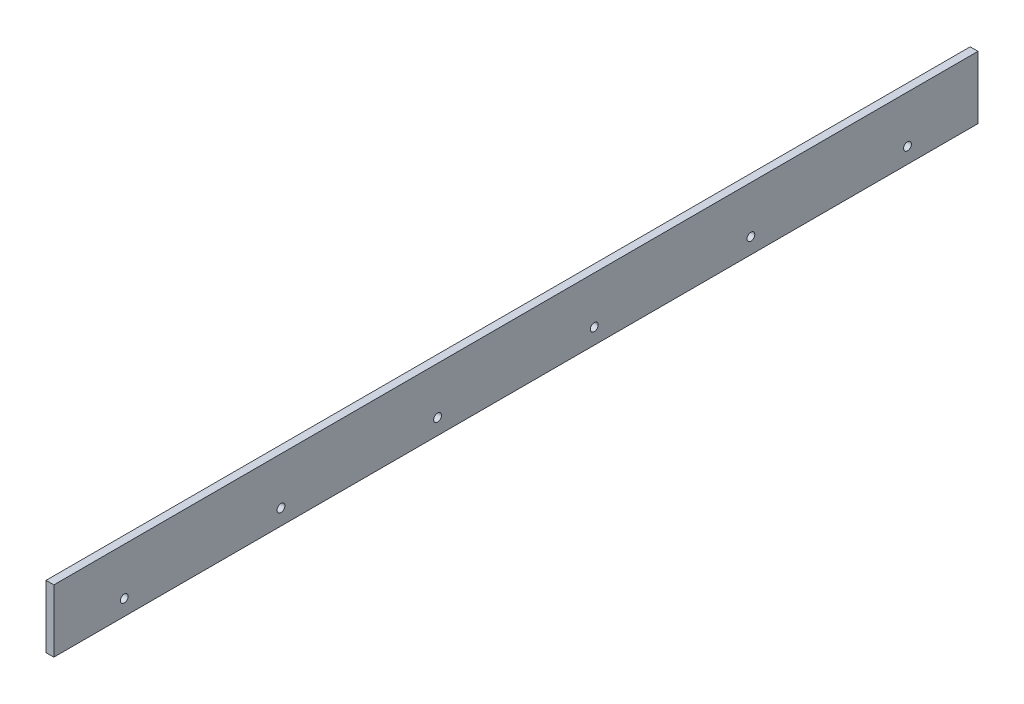
ISO-10303-21;
HEADER;
FILE_DESCRIPTION(('STEP AP214'),'2;1');
FILE_NAME('part.step','',(''),(''),'','','');
FILE_SCHEMA(('AUTOMOTIVE_DESIGN { 1 0 10303 214 1 1 1 1 }'));
ENDSEC;
DATA;
#1=APPLICATION_CONTEXT('core data for automotive mechanical design processes');
#2=APPLICATION_PROTOCOL_DEFINITION('international standard','automotive_design',2000,#1);
#3=PRODUCT_CONTEXT('',#1,'mechanical');
#4=PRODUCT('Part','Part','',(#3));
#5=PRODUCT_RELATED_PRODUCT_CATEGORY('part','',(#4));
#6=PRODUCT_DEFINITION_FORMATION('','',#4);
#7=PRODUCT_DEFINITION_CONTEXT('part definition',#1,'design');
#8=PRODUCT_DEFINITION('design','',#6,#7);
#9=PRODUCT_DEFINITION_SHAPE('','',#8);
#10=(LENGTH_UNIT() NAMED_UNIT(*) SI_UNIT(.MILLI.,.METRE.));
#11=(NAMED_UNIT(*) PLANE_ANGLE_UNIT() SI_UNIT($,.RADIAN.));
#12=(NAMED_UNIT(*) SI_UNIT($,.STERADIAN.) SOLID_ANGLE_UNIT());
#13=UNCERTAINTY_MEASURE_WITH_UNIT(LENGTH_MEASURE(1.E-05),#10,'distance_accuracy_value','');
#14=(GEOMETRIC_REPRESENTATION_CONTEXT(3) GLOBAL_UNCERTAINTY_ASSIGNED_CONTEXT((#13)) GLOBAL_UNIT_ASSIGNED_CONTEXT((#10,
#11,#12)) REPRESENTATION_CONTEXT('',''));
#15=CARTESIAN_POINT('',(0.,0.,0.));
#16=DIRECTION('',(0.,0.,1.));
#17=DIRECTION('',(1.,0.,0.));
#18=AXIS2_PLACEMENT_3D('',#15,#16,#17);
#19=CARTESIAN_POINT('',(2.5,20.,590.));
#20=DIRECTION('',(-1.,0.,0.));
#21=DIRECTION('',(0.,-1.,0.));
#22=AXIS2_PLACEMENT_3D('',#19,#20,#21);
#23=PLANE('',#22);
#24=CARTESIAN_POINT('',(2.5,-10.,445.));
#25=DIRECTION('',(1.,0.,0.));
#26=DIRECTION('',(0.,1.,0.));
#27=AXIS2_PLACEMENT_3D('',#24,#25,#26);
#28=CIRCLE('',#27,2.50000000000002);
#29=CARTESIAN_POINT('',(2.5,-7.49999999999998,445.));
#30=VERTEX_POINT('',#29);
#31=EDGE_CURVE('E145',#30,#30,#28,.T.);
#32=ORIENTED_EDGE('',*,*,#31,.F.);
#33=EDGE_LOOP('',(#32));
#34=FACE_BOUND('',#33,.T.);
#35=DIRECTION('',(0.,1.,0.));
#36=VECTOR('',#35,1.);
#37=CARTESIAN_POINT('',(2.5,20.,0.));
#38=LINE('',#37,#36);
#39=CARTESIAN_POINT('',(2.5,-20.,0.));
#40=VERTEX_POINT('',#39);
#41=CARTESIAN_POINT('',(2.5,20.,0.));
#42=VERTEX_POINT('',#41);
#43=EDGE_CURVE('E103',#40,#42,#38,.T.);
#44=ORIENTED_EDGE('',*,*,#43,.T.);
#45=DIRECTION('',(0.,0.,-1.));
#46=VECTOR('',#45,1.);
#47=CARTESIAN_POINT('',(2.5,20.,590.));
#48=LINE('',#47,#46);
#49=CARTESIAN_POINT('',(2.5,20.,590.));
#50=VERTEX_POINT('',#49);
#51=EDGE_CURVE('E11',#50,#42,#48,.T.);
#52=ORIENTED_EDGE('',*,*,#51,.F.);
#53=DIRECTION('',(0.,1.,0.));
#54=VECTOR('',#53,1.);
#55=CARTESIAN_POINT('',(2.5,20.,590.));
#56=LINE('',#55,#54);
#57=CARTESIAN_POINT('',(2.5,-20.,590.));
#58=VERTEX_POINT('',#57);
#59=EDGE_CURVE('E90',#58,#50,#56,.T.);
#60=ORIENTED_EDGE('',*,*,#59,.F.);
#61=DIRECTION('',(0.,0.,-1.));
#62=VECTOR('',#61,1.);
#63=CARTESIAN_POINT('',(2.5,-20.,590.));
#64=LINE('',#63,#62);
#65=EDGE_CURVE('E99',#58,#40,#64,.T.);
#66=ORIENTED_EDGE('',*,*,#65,.T.);
#67=EDGE_LOOP('',(#44,#52,#60,#66));
#68=FACE_BOUND('',#67,.T.);
#69=CARTESIAN_POINT('',(2.5,-9.99999999999994,45.));
#70=DIRECTION('',(-1.,0.,0.));
#71=DIRECTION('',(0.,-1.,0.));
#72=AXIS2_PLACEMENT_3D('',#69,#70,#71);
#73=CIRCLE('',#72,2.5);
#74=CARTESIAN_POINT('',(2.5,-12.4999999999999,45.));
#75=VERTEX_POINT('',#74);
#76=EDGE_CURVE('E121',#75,#75,#73,.T.);
#77=ORIENTED_EDGE('',*,*,#76,.T.);
#78=EDGE_LOOP('',(#77));
#79=FACE_BOUND('',#78,.T.);
#80=CARTESIAN_POINT('',(2.5,-9.99999999999997,145.));
#81=DIRECTION('',(-1.,0.,0.));
#82=DIRECTION('',(0.,-1.,0.));
#83=AXIS2_PLACEMENT_3D('',#80,#81,#82);
#84=CIRCLE('',#83,2.5);
#85=CARTESIAN_POINT('',(2.5,-12.5,145.));
#86=VERTEX_POINT('',#85);
#87=EDGE_CURVE('E127',#86,#86,#84,.T.);
#88=ORIENTED_EDGE('',*,*,#87,.T.);
#89=EDGE_LOOP('',(#88));
#90=FACE_BOUND('',#89,.T.);
#91=CARTESIAN_POINT('',(2.5,-9.99999999999999,245.));
#92=DIRECTION('',(-1.,0.,0.));
#93=DIRECTION('',(0.,-1.,0.));
#94=AXIS2_PLACEMENT_3D('',#91,#92,#93);
#95=CIRCLE('',#94,2.5);
#96=CARTESIAN_POINT('',(2.5,-12.5,245.));
#97=VERTEX_POINT('',#96);
#98=EDGE_CURVE('E133',#97,#97,#95,.T.);
#99=ORIENTED_EDGE('',*,*,#98,.T.);
#100=EDGE_LOOP('',(#99));
#101=FACE_BOUND('',#100,.T.);
#102=CARTESIAN_POINT('',(2.5,-10.,345.));
#103=DIRECTION('',(1.,0.,0.));
#104=DIRECTION('',(0.,1.,0.));
#105=AXIS2_PLACEMENT_3D('',#102,#103,#104);
#106=CIRCLE('',#105,2.50000000000002);
#107=CARTESIAN_POINT('',(2.5,-7.49999999999998,345.));
#108=VERTEX_POINT('',#107);
#109=EDGE_CURVE('E139',#108,#108,#106,.T.);
#110=ORIENTED_EDGE('',*,*,#109,.F.);
#111=EDGE_LOOP('',(#110));
#112=FACE_BOUND('',#111,.T.);
#113=CARTESIAN_POINT('',(2.5,-10.,545.));
#114=DIRECTION('',(1.,0.,0.));
#115=DIRECTION('',(0.,1.,0.));
#116=AXIS2_PLACEMENT_3D('',#113,#114,#115);
#117=CIRCLE('',#116,2.49999999999991);
#118=CARTESIAN_POINT('',(2.5,-7.50000000000009,545.));
#119=VERTEX_POINT('',#118);
#120=EDGE_CURVE('E148',#119,#119,#117,.T.);
#121=ORIENTED_EDGE('',*,*,#120,.F.);
#122=EDGE_LOOP('',(#121));
#123=FACE_BOUND('',#122,.T.);
#124=ADVANCED_FACE('F39',(#34,#68,#79,#90,#101,#112,#123),#23,.F.);
#125=CARTESIAN_POINT('',(-2.5,20.,590.));
#126=DIRECTION('',(1.,0.,0.));
#127=DIRECTION('',(0.,1.,0.));
#128=AXIS2_PLACEMENT_3D('',#125,#126,#127);
#129=PLANE('',#128);
#130=CARTESIAN_POINT('',(-2.5,-10.,445.));
#131=DIRECTION('',(1.,0.,0.));
#132=DIRECTION('',(0.,1.,0.));
#133=AXIS2_PLACEMENT_3D('',#130,#131,#132);
#134=CIRCLE('',#133,2.50000000000002);
#135=CARTESIAN_POINT('',(-2.5,-7.49999999999998,445.));
#136=VERTEX_POINT('',#135);
#137=EDGE_CURVE('E142',#136,#136,#134,.T.);
#138=ORIENTED_EDGE('',*,*,#137,.T.);
#139=EDGE_LOOP('',(#138));
#140=FACE_BOUND('',#139,.T.);
#141=DIRECTION('',(0.,-1.,0.));
#142=VECTOR('',#141,1.);
#143=CARTESIAN_POINT('',(-2.5,20.,0.));
#144=LINE('',#143,#142);
#145=CARTESIAN_POINT('',(-2.5,20.,0.));
#146=VERTEX_POINT('',#145);
#147=CARTESIAN_POINT('',(-2.5,-20.,0.));
#148=VERTEX_POINT('',#147);
#149=EDGE_CURVE('E72',#146,#148,#144,.T.);
#150=ORIENTED_EDGE('',*,*,#149,.T.);
#151=DIRECTION('',(0.,0.,-1.));
#152=VECTOR('',#151,1.);
#153=CARTESIAN_POINT('',(-2.5,-20.,590.));
#154=LINE('',#153,#152);
#155=CARTESIAN_POINT('',(-2.5,-20.,590.));
#156=VERTEX_POINT('',#155);
#157=EDGE_CURVE('E95',#156,#148,#154,.T.);
#158=ORIENTED_EDGE('',*,*,#157,.F.);
#159=DIRECTION('',(0.,-1.,0.));
#160=VECTOR('',#159,1.);
#161=CARTESIAN_POINT('',(-2.5,20.,590.));
#162=LINE('',#161,#160);
#163=CARTESIAN_POINT('',(-2.5,20.,590.));
#164=VERTEX_POINT('',#163);
#165=EDGE_CURVE('E88',#164,#156,#162,.T.);
#166=ORIENTED_EDGE('',*,*,#165,.F.);
#167=DIRECTION('',(0.,0.,-1.));
#168=VECTOR('',#167,1.);
#169=CARTESIAN_POINT('',(-2.5,20.,590.));
#170=LINE('',#169,#168);
#171=EDGE_CURVE('E47',#164,#146,#170,.T.);
#172=ORIENTED_EDGE('',*,*,#171,.T.);
#173=EDGE_LOOP('',(#150,#158,#166,#172));
#174=FACE_BOUND('',#173,.T.);
#175=CARTESIAN_POINT('',(-2.5,-9.99999999999994,45.));
#176=DIRECTION('',(-1.,0.,0.));
#177=DIRECTION('',(0.,-1.,0.));
#178=AXIS2_PLACEMENT_3D('',#175,#176,#177);
#179=CIRCLE('',#178,2.5);
#180=CARTESIAN_POINT('',(-2.5,-12.4999999999999,45.));
#181=VERTEX_POINT('',#180);
#182=EDGE_CURVE('E118',#181,#181,#179,.T.);
#183=ORIENTED_EDGE('',*,*,#182,.F.);
#184=EDGE_LOOP('',(#183));
#185=FACE_BOUND('',#184,.T.);
#186=CARTESIAN_POINT('',(-2.5,-9.99999999999997,145.));
#187=DIRECTION('',(-1.,0.,0.));
#188=DIRECTION('',(0.,-1.,0.));
#189=AXIS2_PLACEMENT_3D('',#186,#187,#188);
#190=CIRCLE('',#189,2.5);
#191=CARTESIAN_POINT('',(-2.5,-12.5,145.));
#192=VERTEX_POINT('',#191);
#193=EDGE_CURVE('E124',#192,#192,#190,.T.);
#194=ORIENTED_EDGE('',*,*,#193,.F.);
#195=EDGE_LOOP('',(#194));
#196=FACE_BOUND('',#195,.T.);
#197=CARTESIAN_POINT('',(-2.5,-9.99999999999999,245.));
#198=DIRECTION('',(-1.,0.,0.));
#199=DIRECTION('',(0.,-1.,0.));
#200=AXIS2_PLACEMENT_3D('',#197,#198,#199);
#201=CIRCLE('',#200,2.5);
#202=CARTESIAN_POINT('',(-2.5,-12.5,245.));
#203=VERTEX_POINT('',#202);
#204=EDGE_CURVE('E130',#203,#203,#201,.T.);
#205=ORIENTED_EDGE('',*,*,#204,.F.);
#206=EDGE_LOOP('',(#205));
#207=FACE_BOUND('',#206,.T.);
#208=CARTESIAN_POINT('',(-2.5,-10.,345.));
#209=DIRECTION('',(1.,0.,0.));
#210=DIRECTION('',(0.,1.,0.));
#211=AXIS2_PLACEMENT_3D('',#208,#209,#210);
#212=CIRCLE('',#211,2.50000000000002);
#213=CARTESIAN_POINT('',(-2.5,-7.49999999999998,345.));
#214=VERTEX_POINT('',#213);
#215=EDGE_CURVE('E136',#214,#214,#212,.T.);
#216=ORIENTED_EDGE('',*,*,#215,.T.);
#217=EDGE_LOOP('',(#216));
#218=FACE_BOUND('',#217,.T.);
#219=CARTESIAN_POINT('',(-2.5,-10.,545.));
#220=DIRECTION('',(1.,0.,0.));
#221=DIRECTION('',(0.,1.,0.));
#222=AXIS2_PLACEMENT_3D('',#219,#220,#221);
#223=CIRCLE('',#222,2.49999999999991);
#224=CARTESIAN_POINT('',(-2.5,-7.50000000000009,545.));
#225=VERTEX_POINT('',#224);
#226=EDGE_CURVE('E106',#225,#225,#223,.T.);
#227=ORIENTED_EDGE('',*,*,#226,.T.);
#228=EDGE_LOOP('',(#227));
#229=FACE_BOUND('',#228,.T.);
#230=ADVANCED_FACE('F96',(#140,#174,#185,#196,#207,#218,#229),#129,.F.);
#231=CARTESIAN_POINT('',(-2.5,20.,590.));
#232=DIRECTION('',(0.,-1.,0.));
#233=DIRECTION('',(0.,0.,-1.));
#234=AXIS2_PLACEMENT_3D('',#231,#232,#233);
#235=PLANE('',#234);
#236=DIRECTION('',(-1.,0.,0.));
#237=VECTOR('',#236,1.);
#238=CARTESIAN_POINT('',(-2.5,20.,0.));
#239=LINE('',#238,#237);
#240=EDGE_CURVE('E94',#42,#146,#239,.T.);
#241=ORIENTED_EDGE('',*,*,#240,.T.);
#242=ORIENTED_EDGE('',*,*,#171,.F.);
#243=DIRECTION('',(-1.,0.,0.));
#244=VECTOR('',#243,1.);
#245=CARTESIAN_POINT('',(-2.5,20.,590.));
#246=LINE('',#245,#244);
#247=EDGE_CURVE('E85',#50,#164,#246,.T.);
#248=ORIENTED_EDGE('',*,*,#247,.F.);
#249=ORIENTED_EDGE('',*,*,#51,.T.);
#250=EDGE_LOOP('',(#241,#242,#248,#249));
#251=FACE_BOUND('',#250,.T.);
#252=ADVANCED_FACE('F93',(#251),#235,.F.);
#253=CARTESIAN_POINT('',(-2.5,-20.,590.));
#254=DIRECTION('',(0.,1.,0.));
#255=DIRECTION('',(0.,0.,1.));
#256=AXIS2_PLACEMENT_3D('',#253,#254,#255);
#257=PLANE('',#256);
#258=DIRECTION('',(1.,0.,0.));
#259=VECTOR('',#258,1.);
#260=CARTESIAN_POINT('',(-2.5,-20.,0.));
#261=LINE('',#260,#259);
#262=EDGE_CURVE('E78',#148,#40,#261,.T.);
#263=ORIENTED_EDGE('',*,*,#262,.T.);
#264=ORIENTED_EDGE('',*,*,#65,.F.);
#265=DIRECTION('',(1.,0.,0.));
#266=VECTOR('',#265,1.);
#267=CARTESIAN_POINT('',(-2.5,-20.,590.));
#268=LINE('',#267,#266);
#269=EDGE_CURVE('E55',#156,#58,#268,.T.);
#270=ORIENTED_EDGE('',*,*,#269,.F.);
#271=ORIENTED_EDGE('',*,*,#157,.T.);
#272=EDGE_LOOP('',(#263,#264,#270,#271));
#273=FACE_BOUND('',#272,.T.);
#274=ADVANCED_FACE('F111',(#273),#257,.F.);
#275=CARTESIAN_POINT('',(0.,0.,590.));
#276=DIRECTION('',(0.,0.,1.));
#277=DIRECTION('',(1.,0.,0.));
#278=AXIS2_PLACEMENT_3D('',#275,#276,#277);
#279=PLANE('',#278);
#280=ORIENTED_EDGE('',*,*,#59,.T.);
#281=ORIENTED_EDGE('',*,*,#247,.T.);
#282=ORIENTED_EDGE('',*,*,#165,.T.);
#283=ORIENTED_EDGE('',*,*,#269,.T.);
#284=EDGE_LOOP('',(#280,#281,#282,#283));
#285=FACE_BOUND('',#284,.T.);
#286=ADVANCED_FACE('F86',(#285),#279,.T.);
#287=CARTESIAN_POINT('',(0.,0.,0.));
#288=DIRECTION('',(0.,0.,1.));
#289=DIRECTION('',(1.,0.,0.));
#290=AXIS2_PLACEMENT_3D('',#287,#288,#289);
#291=PLANE('',#290);
#292=ORIENTED_EDGE('',*,*,#43,.F.);
#293=ORIENTED_EDGE('',*,*,#262,.F.);
#294=ORIENTED_EDGE('',*,*,#149,.F.);
#295=ORIENTED_EDGE('',*,*,#240,.F.);
#296=EDGE_LOOP('',(#292,#293,#294,#295));
#297=FACE_BOUND('',#296,.T.);
#298=ADVANCED_FACE('F114',(#297),#291,.F.);
#299=CARTESIAN_POINT('',(-2.5,-9.99999999999994,45.));
#300=DIRECTION('',(1.,0.,0.));
#301=DIRECTION('',(0.,1.,0.));
#302=AXIS2_PLACEMENT_3D('',#299,#300,#301);
#303=CYLINDRICAL_SURFACE('',#302,2.5);
#304=ORIENTED_EDGE('',*,*,#182,.T.);
#305=EDGE_LOOP('',(#304));
#306=FACE_BOUND('',#305,.T.);
#307=ORIENTED_EDGE('',*,*,#76,.F.);
#308=EDGE_LOOP('',(#307));
#309=FACE_BOUND('',#308,.T.);
#310=ADVANCED_FACE('F189',(#306,#309),#303,.F.);
#311=CARTESIAN_POINT('',(-2.5,-9.99999999999997,145.));
#312=DIRECTION('',(1.,0.,0.));
#313=DIRECTION('',(0.,1.,0.));
#314=AXIS2_PLACEMENT_3D('',#311,#312,#313);
#315=CYLINDRICAL_SURFACE('',#314,2.5);
#316=ORIENTED_EDGE('',*,*,#193,.T.);
#317=EDGE_LOOP('',(#316));
#318=FACE_BOUND('',#317,.T.);
#319=ORIENTED_EDGE('',*,*,#87,.F.);
#320=EDGE_LOOP('',(#319));
#321=FACE_BOUND('',#320,.T.);
#322=ADVANCED_FACE('F185',(#318,#321),#315,.F.);
#323=CARTESIAN_POINT('',(-2.5,-9.99999999999999,245.));
#324=DIRECTION('',(1.,0.,0.));
#325=DIRECTION('',(0.,1.,0.));
#326=AXIS2_PLACEMENT_3D('',#323,#324,#325);
#327=CYLINDRICAL_SURFACE('',#326,2.5);
#328=ORIENTED_EDGE('',*,*,#204,.T.);
#329=EDGE_LOOP('',(#328));
#330=FACE_BOUND('',#329,.T.);
#331=ORIENTED_EDGE('',*,*,#98,.F.);
#332=EDGE_LOOP('',(#331));
#333=FACE_BOUND('',#332,.T.);
#334=ADVANCED_FACE('F178',(#330,#333),#327,.F.);
#335=CARTESIAN_POINT('',(-2.5,-10.,345.));
#336=DIRECTION('',(1.,0.,0.));
#337=DIRECTION('',(0.,1.,0.));
#338=AXIS2_PLACEMENT_3D('',#335,#336,#337);
#339=CYLINDRICAL_SURFACE('',#338,2.50000000000002);
#340=ORIENTED_EDGE('',*,*,#215,.F.);
#341=EDGE_LOOP('',(#340));
#342=FACE_BOUND('',#341,.T.);
#343=ORIENTED_EDGE('',*,*,#109,.T.);
#344=EDGE_LOOP('',(#343));
#345=FACE_BOUND('',#344,.T.);
#346=ADVANCED_FACE('F172',(#342,#345),#339,.F.);
#347=CARTESIAN_POINT('',(-2.5,-10.,445.));
#348=DIRECTION('',(1.,0.,0.));
#349=DIRECTION('',(0.,1.,0.));
#350=AXIS2_PLACEMENT_3D('',#347,#348,#349);
#351=CYLINDRICAL_SURFACE('',#350,2.50000000000002);
#352=ORIENTED_EDGE('',*,*,#137,.F.);
#353=EDGE_LOOP('',(#352));
#354=FACE_BOUND('',#353,.T.);
#355=ORIENTED_EDGE('',*,*,#31,.T.);
#356=EDGE_LOOP('',(#355));
#357=FACE_BOUND('',#356,.T.);
#358=ADVANCED_FACE('F158',(#354,#357),#351,.F.);
#359=CARTESIAN_POINT('',(-2.5,-10.,545.));
#360=DIRECTION('',(1.,0.,0.));
#361=DIRECTION('',(0.,1.,0.));
#362=AXIS2_PLACEMENT_3D('',#359,#360,#361);
#363=CYLINDRICAL_SURFACE('',#362,2.49999999999991);
#364=ORIENTED_EDGE('',*,*,#226,.F.);
#365=EDGE_LOOP('',(#364));
#366=FACE_BOUND('',#365,.T.);
#367=ORIENTED_EDGE('',*,*,#120,.T.);
#368=EDGE_LOOP('',(#367));
#369=FACE_BOUND('',#368,.T.);
#370=ADVANCED_FACE('F155',(#366,#369),#363,.F.);
#371=CLOSED_SHELL('',(#124,#230,#252,#274,#286,#298,#310,#322,#334,#346,#358,#370));
#372=MANIFOLD_SOLID_BREP('B2',#371);
#373=ADVANCED_BREP_SHAPE_REPRESENTATION('',(#18,#372),#14);
#374=SHAPE_DEFINITION_REPRESENTATION(#9,#373);
ENDSEC;
END-ISO-10303-21;
